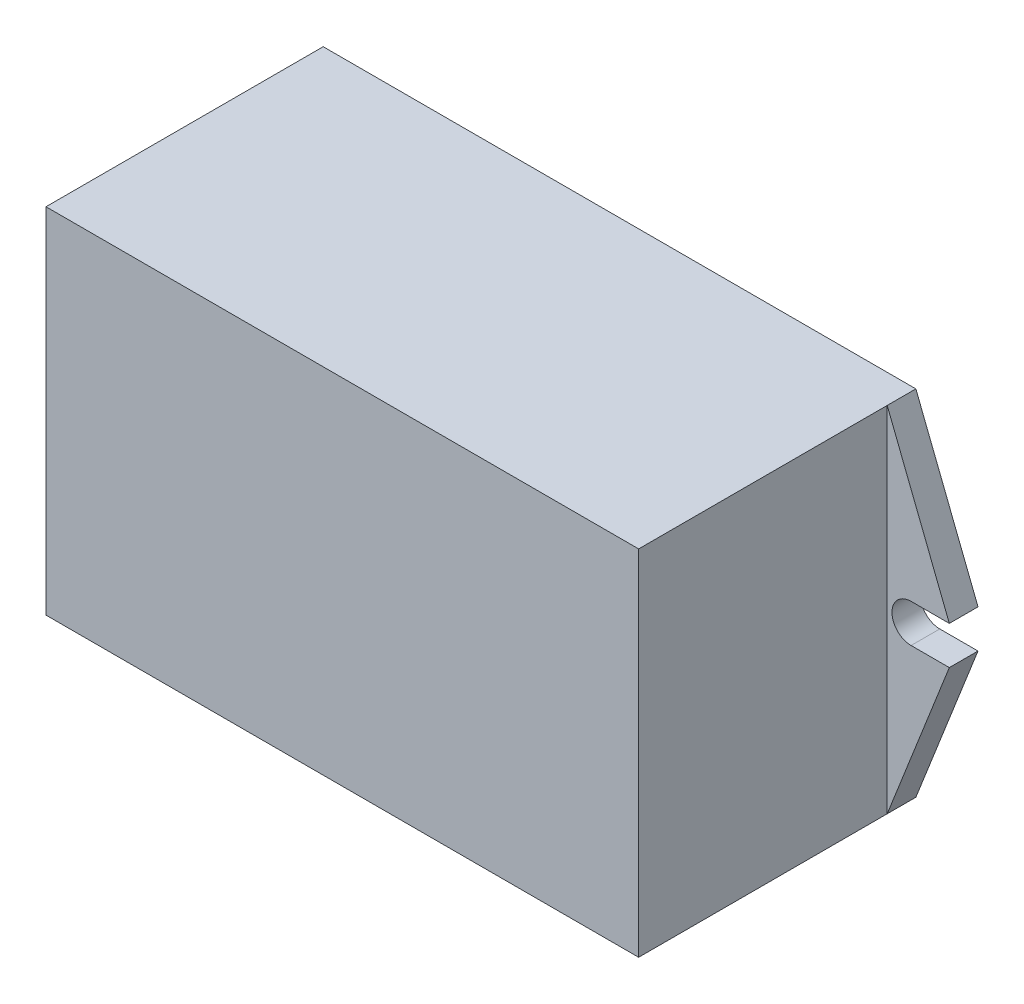
ISO-10303-21;
HEADER;
FILE_DESCRIPTION(('STEP AP214'),'2;1');
FILE_NAME('part.step','',(''),(''),'','','');
FILE_SCHEMA(('AUTOMOTIVE_DESIGN { 1 0 10303 214 1 1 1 1 }'));
ENDSEC;
DATA;
#1=APPLICATION_CONTEXT('core data for automotive mechanical design processes');
#2=APPLICATION_PROTOCOL_DEFINITION('international standard','automotive_design',2000,#1);
#3=PRODUCT_CONTEXT('',#1,'mechanical');
#4=PRODUCT('Part','Part','',(#3));
#5=PRODUCT_RELATED_PRODUCT_CATEGORY('part','',(#4));
#6=PRODUCT_DEFINITION_FORMATION('','',#4);
#7=PRODUCT_DEFINITION_CONTEXT('part definition',#1,'design');
#8=PRODUCT_DEFINITION('design','',#6,#7);
#9=PRODUCT_DEFINITION_SHAPE('','',#8);
#10=(LENGTH_UNIT() NAMED_UNIT(*) SI_UNIT(.MILLI.,.METRE.));
#11=(NAMED_UNIT(*) PLANE_ANGLE_UNIT() SI_UNIT($,.RADIAN.));
#12=(NAMED_UNIT(*) SI_UNIT($,.STERADIAN.) SOLID_ANGLE_UNIT());
#13=UNCERTAINTY_MEASURE_WITH_UNIT(LENGTH_MEASURE(1.E-05),#10,'distance_accuracy_value','');
#14=(GEOMETRIC_REPRESENTATION_CONTEXT(3) GLOBAL_UNCERTAINTY_ASSIGNED_CONTEXT((#13)) GLOBAL_UNIT_ASSIGNED_CONTEXT((#10,
#11,#12)) REPRESENTATION_CONTEXT('',''));
#15=CARTESIAN_POINT('',(0.,0.,0.));
#16=DIRECTION('',(0.,0.,1.));
#17=DIRECTION('',(1.,0.,0.));
#18=AXIS2_PLACEMENT_3D('',#15,#16,#17);
#19=CARTESIAN_POINT('',(0.,0.,3.));
#20=DIRECTION('',(0.,0.,1.));
#21=DIRECTION('',(1.,0.,0.));
#22=AXIS2_PLACEMENT_3D('',#19,#20,#21);
#23=PLANE('',#22);
#24=DIRECTION('',(0.,-1.,0.));
#25=VECTOR('',#24,1.);
#26=CARTESIAN_POINT('',(0.,0.,3.));
#27=LINE('',#26,#25);
#28=CARTESIAN_POINT('',(0.,0.,3.));
#29=VERTEX_POINT('',#28);
#30=CARTESIAN_POINT('',(0.,-37.,3.));
#31=VERTEX_POINT('',#30);
#32=EDGE_CURVE('E145',#29,#31,#27,.T.);
#33=ORIENTED_EDGE('',*,*,#32,.F.);
#34=DIRECTION('',(0.36652451838249,0.930408392817092,0.));
#35=VECTOR('',#34,1.);
#36=CARTESIAN_POINT('',(0.,0.,3.));
#37=LINE('',#36,#35);
#38=CARTESIAN_POINT('',(-6.49999999999999,-16.5,3.));
#39=VERTEX_POINT('',#38);
#40=EDGE_CURVE('E185',#39,#29,#37,.T.);
#41=ORIENTED_EDGE('',*,*,#40,.F.);
#42=DIRECTION('',(-1.,0.,0.));
#43=VECTOR('',#42,1.);
#44=CARTESIAN_POINT('',(0.,-16.5,3.));
#45=LINE('',#44,#43);
#46=CARTESIAN_POINT('',(-2.49999999999999,-16.5,3.));
#47=VERTEX_POINT('',#46);
#48=EDGE_CURVE('E188',#47,#39,#45,.T.);
#49=ORIENTED_EDGE('',*,*,#48,.F.);
#50=CARTESIAN_POINT('',(-2.49999999999999,-18.5,3.));
#51=DIRECTION('',(0.,0.,1.));
#52=DIRECTION('',(1.,0.,0.));
#53=AXIS2_PLACEMENT_3D('',#50,#51,#52);
#54=CIRCLE('',#53,2.);
#55=CARTESIAN_POINT('',(-2.49999999999999,-20.5,3.));
#56=VERTEX_POINT('',#55);
#57=EDGE_CURVE('E191',#56,#47,#54,.T.);
#58=ORIENTED_EDGE('',*,*,#57,.F.);
#59=DIRECTION('',(-1.,0.,0.));
#60=VECTOR('',#59,1.);
#61=CARTESIAN_POINT('',(0.,-20.5,3.));
#62=LINE('',#61,#60);
#63=CARTESIAN_POINT('',(-6.49999999999999,-20.5,3.));
#64=VERTEX_POINT('',#63);
#65=EDGE_CURVE('E194',#56,#64,#62,.T.);
#66=ORIENTED_EDGE('',*,*,#65,.T.);
#67=DIRECTION('',(0.36652451838249,-0.930408392817092,0.));
#68=VECTOR('',#67,1.);
#69=CARTESIAN_POINT('',(-12.6176470588235,-4.97058823529411,3.));
#70=LINE('',#69,#68);
#71=EDGE_CURVE('E165',#64,#31,#70,.T.);
#72=ORIENTED_EDGE('',*,*,#71,.T.);
#73=EDGE_LOOP('',(#33,#41,#49,#58,#66,#72));
#74=FACE_BOUND('',#73,.T.);
#75=ADVANCED_FACE('F35',(#74),#23,.T.);
#76=CARTESIAN_POINT('',(64.5,-18.5,3.));
#77=DIRECTION('',(0.,0.,-1.));
#78=DIRECTION('',(-1.,0.,0.));
#79=AXIS2_PLACEMENT_3D('',#76,#77,#78);
#80=CYLINDRICAL_SURFACE('',#79,2.);
#81=CARTESIAN_POINT('',(64.5,-18.5,0.));
#82=DIRECTION('',(0.,0.,1.));
#83=DIRECTION('',(1.,0.,0.));
#84=AXIS2_PLACEMENT_3D('',#81,#82,#83);
#85=CIRCLE('',#84,2.);
#86=CARTESIAN_POINT('',(64.5,-20.5,0.));
#87=VERTEX_POINT('',#86);
#88=CARTESIAN_POINT('',(64.5,-16.5,0.));
#89=VERTEX_POINT('',#88);
#90=EDGE_CURVE('E174',#87,#89,#85,.F.);
#91=ORIENTED_EDGE('',*,*,#90,.T.);
#92=DIRECTION('',(0.,0.,-1.));
#93=VECTOR('',#92,1.);
#94=CARTESIAN_POINT('',(64.5,-16.5,3.));
#95=LINE('',#94,#93);
#96=CARTESIAN_POINT('',(64.5,-16.5,3.));
#97=VERTEX_POINT('',#96);
#98=EDGE_CURVE('E11',#97,#89,#95,.T.);
#99=ORIENTED_EDGE('',*,*,#98,.F.);
#100=CARTESIAN_POINT('',(64.5,-18.5,3.));
#101=DIRECTION('',(0.,0.,1.));
#102=DIRECTION('',(1.,0.,0.));
#103=AXIS2_PLACEMENT_3D('',#100,#101,#102);
#104=CIRCLE('',#103,2.);
#105=CARTESIAN_POINT('',(64.5,-20.5,3.));
#106=VERTEX_POINT('',#105);
#107=EDGE_CURVE('E180',#106,#97,#104,.F.);
#108=ORIENTED_EDGE('',*,*,#107,.F.);
#109=DIRECTION('',(0.,0.,-1.));
#110=VECTOR('',#109,1.);
#111=CARTESIAN_POINT('',(64.5,-20.5,3.));
#112=LINE('',#111,#110);
#113=EDGE_CURVE('E52',#106,#87,#112,.T.);
#114=ORIENTED_EDGE('',*,*,#113,.T.);
#115=EDGE_LOOP('',(#91,#99,#108,#114));
#116=FACE_BOUND('',#115,.T.);
#117=ADVANCED_FACE('F37',(#116),#80,.F.);
#118=CARTESIAN_POINT('',(0.,-16.5,3.));
#119=DIRECTION('',(0.,1.,0.));
#120=DIRECTION('',(0.,0.,1.));
#121=AXIS2_PLACEMENT_3D('',#118,#119,#120);
#122=PLANE('',#121);
#123=DIRECTION('',(1.,0.,0.));
#124=VECTOR('',#123,1.);
#125=CARTESIAN_POINT('',(0.,-16.5,0.));
#126=LINE('',#125,#124);
#127=CARTESIAN_POINT('',(68.5,-16.5,0.));
#128=VERTEX_POINT('',#127);
#129=EDGE_CURVE('E199',#89,#128,#126,.T.);
#130=ORIENTED_EDGE('',*,*,#129,.T.);
#131=DIRECTION('',(0.,0.,-1.));
#132=VECTOR('',#131,1.);
#133=CARTESIAN_POINT('',(68.5,-16.5,3.));
#134=LINE('',#133,#132);
#135=CARTESIAN_POINT('',(68.5,-16.5,3.));
#136=VERTEX_POINT('',#135);
#137=EDGE_CURVE('E44',#136,#128,#134,.T.);
#138=ORIENTED_EDGE('',*,*,#137,.F.);
#139=DIRECTION('',(1.,0.,0.));
#140=VECTOR('',#139,1.);
#141=CARTESIAN_POINT('',(0.,-16.5,3.));
#142=LINE('',#141,#140);
#143=EDGE_CURVE('E103',#97,#136,#142,.T.);
#144=ORIENTED_EDGE('',*,*,#143,.F.);
#145=ORIENTED_EDGE('',*,*,#98,.T.);
#146=EDGE_LOOP('',(#130,#138,#144,#145));
#147=FACE_BOUND('',#146,.T.);
#148=ADVANCED_FACE('F303',(#147),#122,.F.);
#149=CARTESIAN_POINT('',(53.670906200318,21.1430842607313,3.));
#150=DIRECTION('',(-0.930408392817091,-0.36652451838249,0.));
#151=DIRECTION('',(0.36652451838249,-0.930408392817092,0.));
#152=AXIS2_PLACEMENT_3D('',#149,#150,#151);
#153=PLANE('',#152);
#154=DIRECTION('',(-0.36652451838249,0.930408392817092,0.));
#155=VECTOR('',#154,1.);
#156=CARTESIAN_POINT('',(53.670906200318,21.1430842607313,0.));
#157=LINE('',#156,#155);
#158=CARTESIAN_POINT('',(62.,0.,0.));
#159=VERTEX_POINT('',#158);
#160=EDGE_CURVE('E201',#128,#159,#157,.T.);
#161=ORIENTED_EDGE('',*,*,#160,.T.);
#162=DIRECTION('',(0.,0.,-1.));
#163=VECTOR('',#162,1.);
#164=CARTESIAN_POINT('',(62.,0.,3.));
#165=LINE('',#164,#163);
#166=CARTESIAN_POINT('',(62.,0.,3.));
#167=VERTEX_POINT('',#166);
#168=EDGE_CURVE('E239',#167,#159,#165,.T.);
#169=ORIENTED_EDGE('',*,*,#168,.F.);
#170=DIRECTION('',(-0.36652451838249,0.930408392817092,0.));
#171=VECTOR('',#170,1.);
#172=CARTESIAN_POINT('',(53.670906200318,21.1430842607313,3.));
#173=LINE('',#172,#171);
#174=EDGE_CURVE('E139',#136,#167,#173,.T.);
#175=ORIENTED_EDGE('',*,*,#174,.F.);
#176=ORIENTED_EDGE('',*,*,#137,.T.);
#177=EDGE_LOOP('',(#161,#169,#175,#176));
#178=FACE_BOUND('',#177,.T.);
#179=ADVANCED_FACE('F243',(#178),#153,.F.);
#180=CARTESIAN_POINT('',(0.,0.,3.));
#181=DIRECTION('',(0.,1.,0.));
#182=DIRECTION('',(0.,0.,1.));
#183=AXIS2_PLACEMENT_3D('',#180,#181,#182);
#184=PLANE('',#183);
#185=DIRECTION('',(1.,0.,0.));
#186=VECTOR('',#185,1.);
#187=CARTESIAN_POINT('',(0.,0.,0.));
#188=LINE('',#187,#186);
#189=CARTESIAN_POINT('',(0.,0.,0.));
#190=VERTEX_POINT('',#189);
#191=EDGE_CURVE('E204',#190,#159,#188,.T.);
#192=ORIENTED_EDGE('',*,*,#191,.F.);
#193=DIRECTION('',(0.,0.,-1.));
#194=VECTOR('',#193,1.);
#195=CARTESIAN_POINT('',(0.,0.,3.));
#196=LINE('',#195,#194);
#197=EDGE_CURVE('E237',#29,#190,#196,.T.);
#198=ORIENTED_EDGE('',*,*,#197,.F.);
#199=DIRECTION('',(0.,0.,-1.));
#200=VECTOR('',#199,1.);
#201=CARTESIAN_POINT('',(0.,0.,29.));
#202=LINE('',#201,#200);
#203=CARTESIAN_POINT('',(0.,0.,29.));
#204=VERTEX_POINT('',#203);
#205=EDGE_CURVE('E176',#204,#29,#202,.T.);
#206=ORIENTED_EDGE('',*,*,#205,.F.);
#207=DIRECTION('',(-1.,0.,0.));
#208=VECTOR('',#207,1.);
#209=CARTESIAN_POINT('',(0.,0.,29.));
#210=LINE('',#209,#208);
#211=CARTESIAN_POINT('',(62.,0.,29.));
#212=VERTEX_POINT('',#211);
#213=EDGE_CURVE('E264',#212,#204,#210,.T.);
#214=ORIENTED_EDGE('',*,*,#213,.F.);
#215=DIRECTION('',(0.,0.,-1.));
#216=VECTOR('',#215,1.);
#217=CARTESIAN_POINT('',(62.,0.,29.));
#218=LINE('',#217,#216);
#219=EDGE_CURVE('E171',#212,#167,#218,.T.);
#220=ORIENTED_EDGE('',*,*,#219,.T.);
#221=ORIENTED_EDGE('',*,*,#168,.T.);
#222=EDGE_LOOP('',(#192,#198,#206,#214,#220,#221));
#223=FACE_BOUND('',#222,.T.);
#224=ADVANCED_FACE('F251',(#223),#184,.T.);
#225=CARTESIAN_POINT('',(0.,0.,3.));
#226=DIRECTION('',(-0.930408392817092,0.36652451838249,0.));
#227=DIRECTION('',(-0.36652451838249,-0.930408392817092,0.));
#228=AXIS2_PLACEMENT_3D('',#225,#226,#227);
#229=PLANE('',#228);
#230=DIRECTION('',(0.36652451838249,0.930408392817092,0.));
#231=VECTOR('',#230,1.);
#232=CARTESIAN_POINT('',(0.,0.,0.));
#233=LINE('',#232,#231);
#234=CARTESIAN_POINT('',(-6.49999999999999,-16.5,0.));
#235=VERTEX_POINT('',#234);
#236=EDGE_CURVE('E207',#235,#190,#233,.T.);
#237=ORIENTED_EDGE('',*,*,#236,.F.);
#238=DIRECTION('',(0.,0.,-1.));
#239=VECTOR('',#238,1.);
#240=CARTESIAN_POINT('',(-6.49999999999999,-16.5,3.));
#241=LINE('',#240,#239);
#242=EDGE_CURVE('E235',#39,#235,#241,.T.);
#243=ORIENTED_EDGE('',*,*,#242,.F.);
#244=ORIENTED_EDGE('',*,*,#40,.T.);
#245=ORIENTED_EDGE('',*,*,#197,.T.);
#246=EDGE_LOOP('',(#237,#243,#244,#245));
#247=FACE_BOUND('',#246,.T.);
#248=ADVANCED_FACE('F367',(#247),#229,.T.);
#249=CARTESIAN_POINT('',(0.,-16.5,3.));
#250=DIRECTION('',(0.,-1.,0.));
#251=DIRECTION('',(0.,0.,-1.));
#252=AXIS2_PLACEMENT_3D('',#249,#250,#251);
#253=PLANE('',#252);
#254=DIRECTION('',(-1.,0.,0.));
#255=VECTOR('',#254,1.);
#256=CARTESIAN_POINT('',(0.,-16.5,0.));
#257=LINE('',#256,#255);
#258=CARTESIAN_POINT('',(-2.49999999999999,-16.5,0.));
#259=VERTEX_POINT('',#258);
#260=EDGE_CURVE('E210',#259,#235,#257,.T.);
#261=ORIENTED_EDGE('',*,*,#260,.F.);
#262=DIRECTION('',(0.,0.,-1.));
#263=VECTOR('',#262,1.);
#264=CARTESIAN_POINT('',(-2.49999999999999,-16.5,3.));
#265=LINE('',#264,#263);
#266=EDGE_CURVE('E233',#47,#259,#265,.T.);
#267=ORIENTED_EDGE('',*,*,#266,.F.);
#268=ORIENTED_EDGE('',*,*,#48,.T.);
#269=ORIENTED_EDGE('',*,*,#242,.T.);
#270=EDGE_LOOP('',(#261,#267,#268,#269));
#271=FACE_BOUND('',#270,.T.);
#272=ADVANCED_FACE('F372',(#271),#253,.T.);
#273=CARTESIAN_POINT('',(-2.49999999999999,-18.5,3.));
#274=DIRECTION('',(0.,0.,-1.));
#275=DIRECTION('',(-1.,0.,0.));
#276=AXIS2_PLACEMENT_3D('',#273,#274,#275);
#277=CYLINDRICAL_SURFACE('',#276,2.);
#278=CARTESIAN_POINT('',(-2.49999999999999,-18.5,0.));
#279=DIRECTION('',(0.,0.,1.));
#280=DIRECTION('',(1.,0.,0.));
#281=AXIS2_PLACEMENT_3D('',#278,#279,#280);
#282=CIRCLE('',#281,2.);
#283=CARTESIAN_POINT('',(-2.49999999999999,-20.5,0.));
#284=VERTEX_POINT('',#283);
#285=EDGE_CURVE('E213',#284,#259,#282,.T.);
#286=ORIENTED_EDGE('',*,*,#285,.F.);
#287=DIRECTION('',(0.,0.,-1.));
#288=VECTOR('',#287,1.);
#289=CARTESIAN_POINT('',(-2.49999999999999,-20.5,3.));
#290=LINE('',#289,#288);
#291=EDGE_CURVE('E231',#56,#284,#290,.T.);
#292=ORIENTED_EDGE('',*,*,#291,.F.);
#293=ORIENTED_EDGE('',*,*,#57,.T.);
#294=ORIENTED_EDGE('',*,*,#266,.T.);
#295=EDGE_LOOP('',(#286,#292,#293,#294));
#296=FACE_BOUND('',#295,.T.);
#297=ADVANCED_FACE('F401',(#296),#277,.F.);
#298=CARTESIAN_POINT('',(0.,-20.5,3.));
#299=DIRECTION('',(0.,-1.,0.));
#300=DIRECTION('',(0.,0.,-1.));
#301=AXIS2_PLACEMENT_3D('',#298,#299,#300);
#302=PLANE('',#301);
#303=DIRECTION('',(-1.,0.,0.));
#304=VECTOR('',#303,1.);
#305=CARTESIAN_POINT('',(0.,-20.5,0.));
#306=LINE('',#305,#304);
#307=CARTESIAN_POINT('',(-6.49999999999999,-20.5,0.));
#308=VERTEX_POINT('',#307);
#309=EDGE_CURVE('E216',#284,#308,#306,.T.);
#310=ORIENTED_EDGE('',*,*,#309,.T.);
#311=DIRECTION('',(0.,0.,-1.));
#312=VECTOR('',#311,1.);
#313=CARTESIAN_POINT('',(-6.49999999999999,-20.5,3.));
#314=LINE('',#313,#312);
#315=EDGE_CURVE('E228',#64,#308,#314,.T.);
#316=ORIENTED_EDGE('',*,*,#315,.F.);
#317=ORIENTED_EDGE('',*,*,#65,.F.);
#318=ORIENTED_EDGE('',*,*,#291,.T.);
#319=EDGE_LOOP('',(#310,#316,#317,#318));
#320=FACE_BOUND('',#319,.T.);
#321=ADVANCED_FACE('F360',(#320),#302,.F.);
#322=CARTESIAN_POINT('',(-12.6176470588235,-4.97058823529411,3.));
#323=DIRECTION('',(0.930408392817091,0.36652451838249,0.));
#324=DIRECTION('',(-0.36652451838249,0.930408392817092,0.));
#325=AXIS2_PLACEMENT_3D('',#322,#323,#324);
#326=PLANE('',#325);
#327=DIRECTION('',(0.36652451838249,-0.930408392817092,0.));
#328=VECTOR('',#327,1.);
#329=CARTESIAN_POINT('',(-12.6176470588235,-4.97058823529411,0.));
#330=LINE('',#329,#328);
#331=CARTESIAN_POINT('',(0.,-37.,0.));
#332=VERTEX_POINT('',#331);
#333=EDGE_CURVE('E218',#308,#332,#330,.T.);
#334=ORIENTED_EDGE('',*,*,#333,.T.);
#335=DIRECTION('',(0.,0.,-1.));
#336=VECTOR('',#335,1.);
#337=CARTESIAN_POINT('',(0.,-37.,3.));
#338=LINE('',#337,#336);
#339=EDGE_CURVE('E161',#31,#332,#338,.T.);
#340=ORIENTED_EDGE('',*,*,#339,.F.);
#341=ORIENTED_EDGE('',*,*,#71,.F.);
#342=ORIENTED_EDGE('',*,*,#315,.T.);
#343=EDGE_LOOP('',(#334,#340,#341,#342));
#344=FACE_BOUND('',#343,.T.);
#345=ADVANCED_FACE('F286',(#344),#326,.F.);
#346=CARTESIAN_POINT('',(0.,-37.,3.));
#347=DIRECTION('',(0.,1.,0.));
#348=DIRECTION('',(0.,0.,1.));
#349=AXIS2_PLACEMENT_3D('',#346,#347,#348);
#350=PLANE('',#349);
#351=DIRECTION('',(1.,0.,0.));
#352=VECTOR('',#351,1.);
#353=CARTESIAN_POINT('',(0.,-37.,0.));
#354=LINE('',#353,#352);
#355=CARTESIAN_POINT('',(62.,-37.,0.));
#356=VERTEX_POINT('',#355);
#357=EDGE_CURVE('E158',#332,#356,#354,.T.);
#358=ORIENTED_EDGE('',*,*,#357,.T.);
#359=DIRECTION('',(0.,0.,-1.));
#360=VECTOR('',#359,1.);
#361=CARTESIAN_POINT('',(62.,-37.,3.));
#362=LINE('',#361,#360);
#363=CARTESIAN_POINT('',(62.,-37.,3.));
#364=VERTEX_POINT('',#363);
#365=EDGE_CURVE('E150',#364,#356,#362,.T.);
#366=ORIENTED_EDGE('',*,*,#365,.F.);
#367=DIRECTION('',(0.,0.,-1.));
#368=VECTOR('',#367,1.);
#369=CARTESIAN_POINT('',(62.,-37.,29.));
#370=LINE('',#369,#368);
#371=CARTESIAN_POINT('',(62.,-37.,29.));
#372=VERTEX_POINT('',#371);
#373=EDGE_CURVE('E154',#372,#364,#370,.T.);
#374=ORIENTED_EDGE('',*,*,#373,.F.);
#375=DIRECTION('',(1.,0.,0.));
#376=VECTOR('',#375,1.);
#377=CARTESIAN_POINT('',(0.,-37.,29.));
#378=LINE('',#377,#376);
#379=CARTESIAN_POINT('',(0.,-37.,29.));
#380=VERTEX_POINT('',#379);
#381=EDGE_CURVE('E257',#380,#372,#378,.T.);
#382=ORIENTED_EDGE('',*,*,#381,.F.);
#383=DIRECTION('',(0.,0.,-1.));
#384=VECTOR('',#383,1.);
#385=CARTESIAN_POINT('',(0.,-37.,29.));
#386=LINE('',#385,#384);
#387=EDGE_CURVE('E170',#380,#31,#386,.T.);
#388=ORIENTED_EDGE('',*,*,#387,.T.);
#389=ORIENTED_EDGE('',*,*,#339,.T.);
#390=EDGE_LOOP('',(#358,#366,#374,#382,#388,#389));
#391=FACE_BOUND('',#390,.T.);
#392=ADVANCED_FACE('F151',(#391),#350,.F.);
#393=CARTESIAN_POINT('',(66.2885532591415,-26.1136724960254,3.));
#394=DIRECTION('',(0.930408392817091,-0.36652451838249,0.));
#395=DIRECTION('',(0.36652451838249,0.930408392817092,0.));
#396=AXIS2_PLACEMENT_3D('',#393,#394,#395);
#397=PLANE('',#396);
#398=DIRECTION('',(-0.36652451838249,-0.930408392817092,0.));
#399=VECTOR('',#398,1.);
#400=CARTESIAN_POINT('',(66.2885532591415,-26.1136724960254,0.));
#401=LINE('',#400,#399);
#402=CARTESIAN_POINT('',(68.5,-20.5,0.));
#403=VERTEX_POINT('',#402);
#404=EDGE_CURVE('E221',#403,#356,#401,.T.);
#405=ORIENTED_EDGE('',*,*,#404,.F.);
#406=DIRECTION('',(0.,0.,-1.));
#407=VECTOR('',#406,1.);
#408=CARTESIAN_POINT('',(68.5,-20.5,3.));
#409=LINE('',#408,#407);
#410=CARTESIAN_POINT('',(68.5,-20.5,3.));
#411=VERTEX_POINT('',#410);
#412=EDGE_CURVE('E91',#411,#403,#409,.T.);
#413=ORIENTED_EDGE('',*,*,#412,.F.);
#414=DIRECTION('',(-0.36652451838249,-0.930408392817092,0.));
#415=VECTOR('',#414,1.);
#416=CARTESIAN_POINT('',(66.2885532591415,-26.1136724960254,3.));
#417=LINE('',#416,#415);
#418=EDGE_CURVE('E137',#411,#364,#417,.T.);
#419=ORIENTED_EDGE('',*,*,#418,.T.);
#420=ORIENTED_EDGE('',*,*,#365,.T.);
#421=EDGE_LOOP('',(#405,#413,#419,#420));
#422=FACE_BOUND('',#421,.T.);
#423=ADVANCED_FACE('F163',(#422),#397,.T.);
#424=CARTESIAN_POINT('',(0.,-20.5,3.));
#425=DIRECTION('',(0.,1.,0.));
#426=DIRECTION('',(0.,0.,1.));
#427=AXIS2_PLACEMENT_3D('',#424,#425,#426);
#428=PLANE('',#427);
#429=DIRECTION('',(1.,0.,0.));
#430=VECTOR('',#429,1.);
#431=CARTESIAN_POINT('',(0.,-20.5,0.));
#432=LINE('',#431,#430);
#433=EDGE_CURVE('E182',#87,#403,#432,.T.);
#434=ORIENTED_EDGE('',*,*,#433,.F.);
#435=ORIENTED_EDGE('',*,*,#113,.F.);
#436=DIRECTION('',(1.,0.,0.));
#437=VECTOR('',#436,1.);
#438=CARTESIAN_POINT('',(0.,-20.5,3.));
#439=LINE('',#438,#437);
#440=EDGE_CURVE('E164',#106,#411,#439,.T.);
#441=ORIENTED_EDGE('',*,*,#440,.T.);
#442=ORIENTED_EDGE('',*,*,#412,.T.);
#443=EDGE_LOOP('',(#434,#435,#441,#442));
#444=FACE_BOUND('',#443,.T.);
#445=ADVANCED_FACE('F289',(#444),#428,.T.);
#446=DIRECTION('',(0.,1.,0.));
#447=VECTOR('',#446,1.);
#448=CARTESIAN_POINT('',(62.,0.,3.));
#449=LINE('',#448,#447);
#450=EDGE_CURVE('E132',#364,#167,#449,.T.);
#451=ORIENTED_EDGE('',*,*,#450,.F.);
#452=ORIENTED_EDGE('',*,*,#418,.F.);
#453=ORIENTED_EDGE('',*,*,#440,.F.);
#454=ORIENTED_EDGE('',*,*,#107,.T.);
#455=ORIENTED_EDGE('',*,*,#143,.T.);
#456=ORIENTED_EDGE('',*,*,#174,.T.);
#457=EDGE_LOOP('',(#451,#452,#453,#454,#455,#456));
#458=FACE_BOUND('',#457,.T.);
#459=ADVANCED_FACE('F134',(#458),#23,.T.);
#460=CARTESIAN_POINT('',(0.,0.,0.));
#461=DIRECTION('',(0.,0.,1.));
#462=DIRECTION('',(1.,0.,0.));
#463=AXIS2_PLACEMENT_3D('',#460,#461,#462);
#464=PLANE('',#463);
#465=ORIENTED_EDGE('',*,*,#90,.F.);
#466=ORIENTED_EDGE('',*,*,#433,.T.);
#467=ORIENTED_EDGE('',*,*,#404,.T.);
#468=ORIENTED_EDGE('',*,*,#357,.F.);
#469=ORIENTED_EDGE('',*,*,#333,.F.);
#470=ORIENTED_EDGE('',*,*,#309,.F.);
#471=ORIENTED_EDGE('',*,*,#285,.T.);
#472=ORIENTED_EDGE('',*,*,#260,.T.);
#473=ORIENTED_EDGE('',*,*,#236,.T.);
#474=ORIENTED_EDGE('',*,*,#191,.T.);
#475=ORIENTED_EDGE('',*,*,#160,.F.);
#476=ORIENTED_EDGE('',*,*,#129,.F.);
#477=EDGE_LOOP('',(#465,#466,#467,#468,#469,#470,#471,#472,#473,#474,#475,#476));
#478=FACE_BOUND('',#477,.T.);
#479=ADVANCED_FACE('F246',(#478),#464,.F.);
#480=CARTESIAN_POINT('',(0.,0.,29.));
#481=DIRECTION('',(1.,0.,0.));
#482=DIRECTION('',(0.,0.,-1.));
#483=AXIS2_PLACEMENT_3D('',#480,#481,#482);
#484=PLANE('',#483);
#485=ORIENTED_EDGE('',*,*,#32,.T.);
#486=ORIENTED_EDGE('',*,*,#387,.F.);
#487=DIRECTION('',(0.,-1.,0.));
#488=VECTOR('',#487,1.);
#489=CARTESIAN_POINT('',(0.,0.,29.));
#490=LINE('',#489,#488);
#491=EDGE_CURVE('E144',#204,#380,#490,.T.);
#492=ORIENTED_EDGE('',*,*,#491,.F.);
#493=ORIENTED_EDGE('',*,*,#205,.T.);
#494=EDGE_LOOP('',(#485,#486,#492,#493));
#495=FACE_BOUND('',#494,.T.);
#496=ADVANCED_FACE('F272',(#495),#484,.F.);
#497=CARTESIAN_POINT('',(62.,0.,29.));
#498=DIRECTION('',(-1.,0.,0.));
#499=DIRECTION('',(0.,0.,1.));
#500=AXIS2_PLACEMENT_3D('',#497,#498,#499);
#501=PLANE('',#500);
#502=ORIENTED_EDGE('',*,*,#450,.T.);
#503=ORIENTED_EDGE('',*,*,#219,.F.);
#504=DIRECTION('',(0.,1.,0.));
#505=VECTOR('',#504,1.);
#506=CARTESIAN_POINT('',(62.,0.,29.));
#507=LINE('',#506,#505);
#508=EDGE_CURVE('E169',#372,#212,#507,.T.);
#509=ORIENTED_EDGE('',*,*,#508,.F.);
#510=ORIENTED_EDGE('',*,*,#373,.T.);
#511=EDGE_LOOP('',(#502,#503,#509,#510));
#512=FACE_BOUND('',#511,.T.);
#513=ADVANCED_FACE('F167',(#512),#501,.F.);
#514=CARTESIAN_POINT('',(0.,0.,29.));
#515=DIRECTION('',(0.,0.,1.));
#516=DIRECTION('',(1.,0.,0.));
#517=AXIS2_PLACEMENT_3D('',#514,#515,#516);
#518=PLANE('',#517);
#519=ORIENTED_EDGE('',*,*,#491,.T.);
#520=ORIENTED_EDGE('',*,*,#381,.T.);
#521=ORIENTED_EDGE('',*,*,#508,.T.);
#522=ORIENTED_EDGE('',*,*,#213,.T.);
#523=EDGE_LOOP('',(#519,#520,#521,#522));
#524=FACE_BOUND('',#523,.T.);
#525=ADVANCED_FACE('F265',(#524),#518,.T.);
#526=CLOSED_SHELL('',(#75,#117,#148,#179,#224,#248,#272,#297,#321,#345,#392,#423,#445,#459,#479,
#496,#513,#525));
#527=MANIFOLD_SOLID_BREP('B2',#526);
#528=ADVANCED_BREP_SHAPE_REPRESENTATION('',(#18,#527),#14);
#529=SHAPE_DEFINITION_REPRESENTATION(#9,#528);
ENDSEC;
END-ISO-10303-21;
